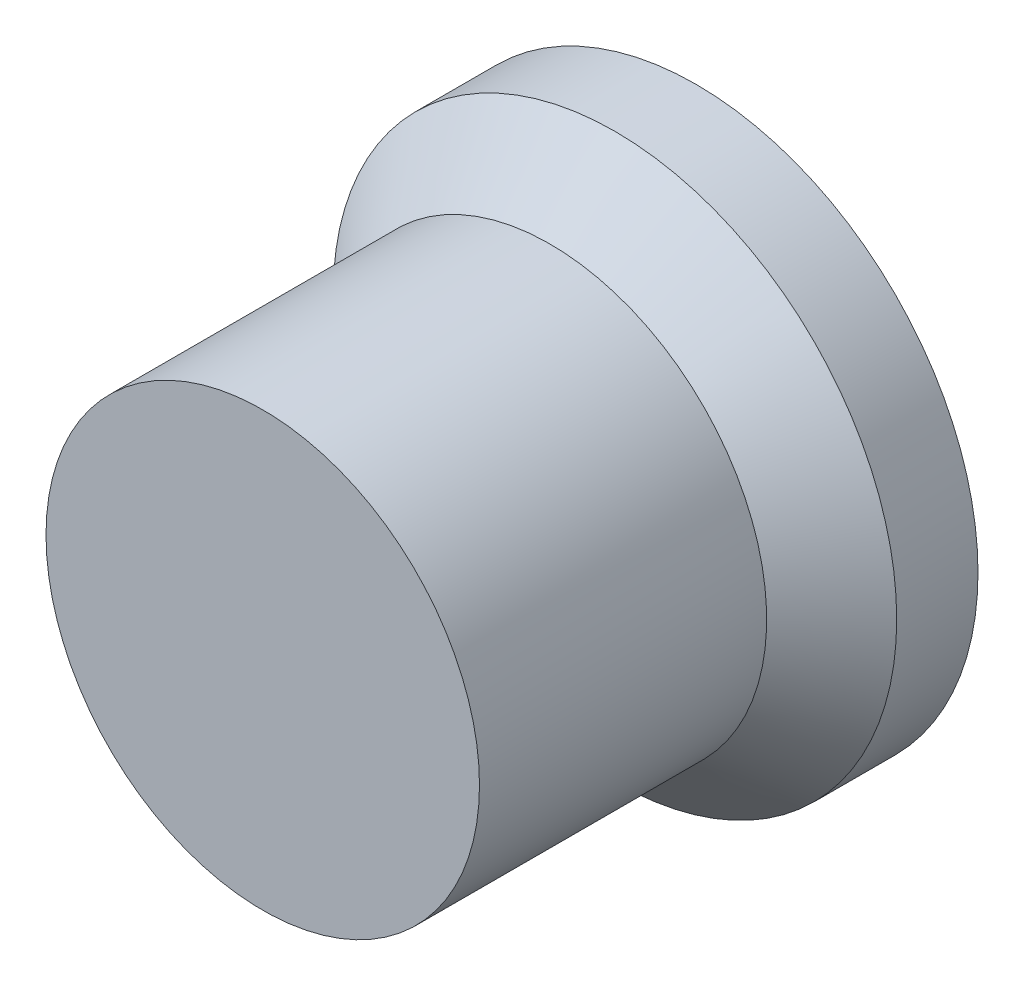
ISO-10303-21;
HEADER;
FILE_DESCRIPTION(('STEP AP214'),'2;1');
FILE_NAME('part.step','',(''),(''),'','','');
FILE_SCHEMA(('AUTOMOTIVE_DESIGN { 1 0 10303 214 1 1 1 1 }'));
ENDSEC;
DATA;
#1=APPLICATION_CONTEXT('core data for automotive mechanical design processes');
#2=APPLICATION_PROTOCOL_DEFINITION('international standard','automotive_design',2000,#1);
#3=PRODUCT_CONTEXT('',#1,'mechanical');
#4=PRODUCT('Part','Part','',(#3));
#5=PRODUCT_RELATED_PRODUCT_CATEGORY('part','',(#4));
#6=PRODUCT_DEFINITION_FORMATION('','',#4);
#7=PRODUCT_DEFINITION_CONTEXT('part definition',#1,'design');
#8=PRODUCT_DEFINITION('design','',#6,#7);
#9=PRODUCT_DEFINITION_SHAPE('','',#8);
#10=(LENGTH_UNIT() NAMED_UNIT(*) SI_UNIT(.MILLI.,.METRE.));
#11=(NAMED_UNIT(*) PLANE_ANGLE_UNIT() SI_UNIT($,.RADIAN.));
#12=(NAMED_UNIT(*) SI_UNIT($,.STERADIAN.) SOLID_ANGLE_UNIT());
#13=UNCERTAINTY_MEASURE_WITH_UNIT(LENGTH_MEASURE(1.E-05),#10,'distance_accuracy_value','');
#14=(GEOMETRIC_REPRESENTATION_CONTEXT(3) GLOBAL_UNCERTAINTY_ASSIGNED_CONTEXT((#13)) GLOBAL_UNIT_ASSIGNED_CONTEXT((#10,
#11,#12)) REPRESENTATION_CONTEXT('',''));
#15=CARTESIAN_POINT('',(0.,0.,0.));
#16=DIRECTION('',(0.,0.,1.));
#17=DIRECTION('',(1.,0.,0.));
#18=AXIS2_PLACEMENT_3D('',#15,#16,#17);
#19=CARTESIAN_POINT('',(0.,0.,4.));
#20=DIRECTION('',(0.,0.,-1.));
#21=DIRECTION('',(-1.,0.,0.));
#22=AXIS2_PLACEMENT_3D('',#19,#20,#21);
#23=CYLINDRICAL_SURFACE('',#22,2.);
#24=CARTESIAN_POINT('',(0.,0.,1.34999999999999));
#25=DIRECTION('',(0.,0.,-1.));
#26=DIRECTION('',(-1.,0.,0.));
#27=AXIS2_PLACEMENT_3D('',#24,#25,#26);
#28=CIRCLE('',#27,2.);
#29=CARTESIAN_POINT('',(-2.,0.,1.34999999999999));
#30=VERTEX_POINT('',#29);
#31=EDGE_CURVE('E10',#30,#30,#28,.F.);
#32=ORIENTED_EDGE('',*,*,#31,.T.);
#33=EDGE_LOOP('',(#32));
#34=FACE_BOUND('',#33,.T.);
#35=CARTESIAN_POINT('',(0.,0.,4.));
#36=DIRECTION('',(0.,0.,1.));
#37=DIRECTION('',(1.,0.,0.));
#38=AXIS2_PLACEMENT_3D('',#35,#36,#37);
#39=CIRCLE('',#38,2.);
#40=CARTESIAN_POINT('',(2.,0.,4.));
#41=VERTEX_POINT('',#40);
#42=EDGE_CURVE('E43',#41,#41,#39,.T.);
#43=ORIENTED_EDGE('',*,*,#42,.F.);
#44=EDGE_LOOP('',(#43));
#45=FACE_BOUND('',#44,.T.);
#46=ADVANCED_FACE('F32',(#34,#45),#23,.T.);
#47=CARTESIAN_POINT('',(0.,0.,4.));
#48=DIRECTION('',(0.,0.,1.));
#49=DIRECTION('',(1.,0.,0.));
#50=AXIS2_PLACEMENT_3D('',#47,#48,#49);
#51=PLANE('',#50);
#52=ORIENTED_EDGE('',*,*,#42,.T.);
#53=EDGE_LOOP('',(#52));
#54=FACE_BOUND('',#53,.T.);
#55=ADVANCED_FACE('F57',(#54),#51,.T.);
#56=CARTESIAN_POINT('',(0.,0.,1.75));
#57=DIRECTION('',(0.,0.,-1.));
#58=DIRECTION('',(-1.,0.,0.));
#59=AXIS2_PLACEMENT_3D('',#56,#57,#58);
#60=CYLINDRICAL_SURFACE('',#59,2.6);
#61=CARTESIAN_POINT('',(0.,0.,0.749999999999982));
#62=DIRECTION('',(0.,0.,-1.));
#63=DIRECTION('',(-1.,0.,0.));
#64=AXIS2_PLACEMENT_3D('',#61,#62,#63);
#65=CIRCLE('',#64,2.6);
#66=CARTESIAN_POINT('',(-2.6,0.,0.749999999999982));
#67=VERTEX_POINT('',#66);
#68=EDGE_CURVE('E39',#67,#67,#65,.T.);
#69=ORIENTED_EDGE('',*,*,#68,.T.);
#70=EDGE_LOOP('',(#69));
#71=FACE_BOUND('',#70,.T.);
#72=CARTESIAN_POINT('',(0.,0.,0.));
#73=DIRECTION('',(0.,0.,-1.));
#74=DIRECTION('',(-1.,0.,0.));
#75=AXIS2_PLACEMENT_3D('',#72,#73,#74);
#76=CIRCLE('',#75,2.6);
#77=CARTESIAN_POINT('',(-2.6,0.,0.));
#78=VERTEX_POINT('',#77);
#79=EDGE_CURVE('E47',#78,#78,#76,.T.);
#80=ORIENTED_EDGE('',*,*,#79,.F.);
#81=EDGE_LOOP('',(#80));
#82=FACE_BOUND('',#81,.T.);
#83=ADVANCED_FACE('F55',(#71,#82),#60,.T.);
#84=CARTESIAN_POINT('',(0.,0.,0.));
#85=DIRECTION('',(0.,0.,1.));
#86=DIRECTION('',(1.,0.,0.));
#87=AXIS2_PLACEMENT_3D('',#84,#85,#86);
#88=PLANE('',#87);
#89=ORIENTED_EDGE('',*,*,#79,.T.);
#90=EDGE_LOOP('',(#89));
#91=FACE_BOUND('',#90,.T.);
#92=ADVANCED_FACE('F53',(#91),#88,.F.);
#93=CARTESIAN_POINT('',(0.,0.,0.749999999999982));
#94=DIRECTION('',(0.,0.,-1.));
#95=DIRECTION('',(-1.,0.,0.));
#96=AXIS2_PLACEMENT_3D('',#93,#94,#95);
#97=CONICAL_SURFACE('',#96,2.6,0.785398163397443);
#98=ORIENTED_EDGE('',*,*,#31,.F.);
#99=EDGE_LOOP('',(#98));
#100=FACE_BOUND('',#99,.T.);
#101=ORIENTED_EDGE('',*,*,#68,.F.);
#102=EDGE_LOOP('',(#101));
#103=FACE_BOUND('',#102,.T.);
#104=ADVANCED_FACE('F34',(#100,#103),#97,.T.);
#105=CLOSED_SHELL('',(#46,#55,#83,#92,#104));
#106=MANIFOLD_SOLID_BREP('B2',#105);
#107=ADVANCED_BREP_SHAPE_REPRESENTATION('',(#18,#106),#14);
#108=SHAPE_DEFINITION_REPRESENTATION(#9,#107);
ENDSEC;
END-ISO-10303-21;
